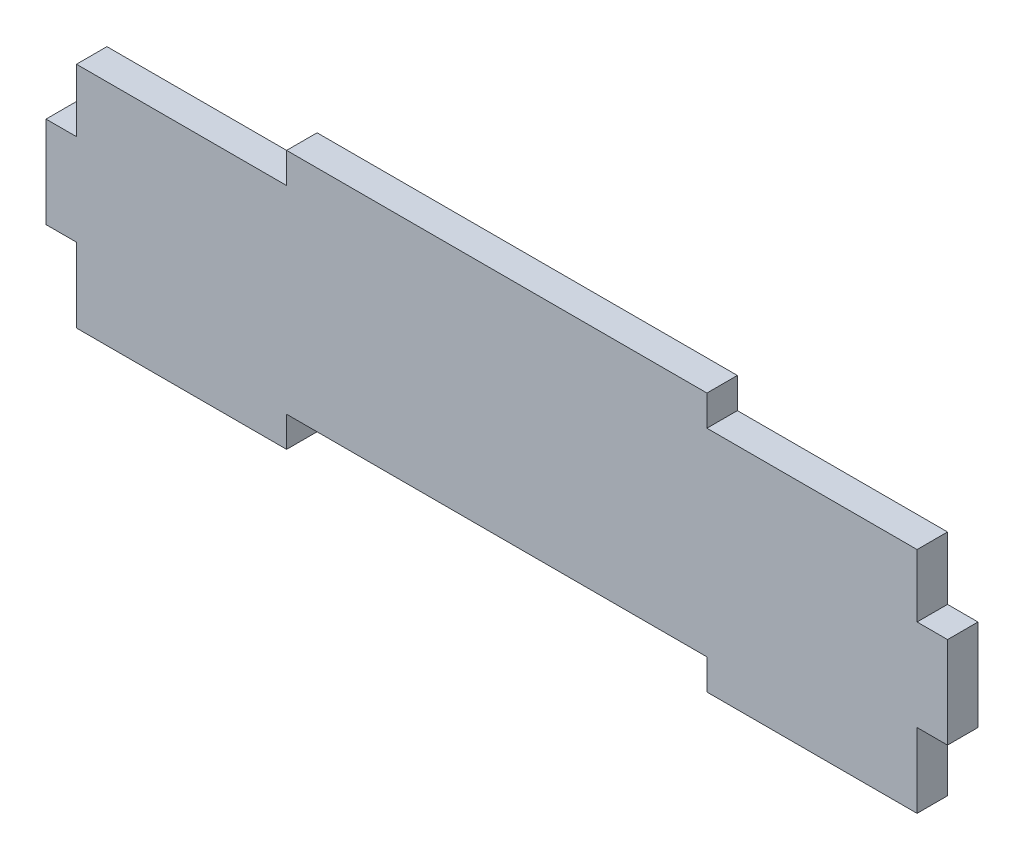
ISO-10303-21;
HEADER;
FILE_DESCRIPTION(('STEP AP214'),'2;1');
FILE_NAME('part.step','',(''),(''),'','','');
FILE_SCHEMA(('AUTOMOTIVE_DESIGN { 1 0 10303 214 1 1 1 1 }'));
ENDSEC;
DATA;
#1=APPLICATION_CONTEXT('core data for automotive mechanical design processes');
#2=APPLICATION_PROTOCOL_DEFINITION('international standard','automotive_design',2000,#1);
#3=PRODUCT_CONTEXT('',#1,'mechanical');
#4=PRODUCT('Part','Part','',(#3));
#5=PRODUCT_RELATED_PRODUCT_CATEGORY('part','',(#4));
#6=PRODUCT_DEFINITION_FORMATION('','',#4);
#7=PRODUCT_DEFINITION_CONTEXT('part definition',#1,'design');
#8=PRODUCT_DEFINITION('design','',#6,#7);
#9=PRODUCT_DEFINITION_SHAPE('','',#8);
#10=(LENGTH_UNIT() NAMED_UNIT(*) SI_UNIT(.MILLI.,.METRE.));
#11=(NAMED_UNIT(*) PLANE_ANGLE_UNIT() SI_UNIT($,.RADIAN.));
#12=(NAMED_UNIT(*) SI_UNIT($,.STERADIAN.) SOLID_ANGLE_UNIT());
#13=UNCERTAINTY_MEASURE_WITH_UNIT(LENGTH_MEASURE(1.E-05),#10,'distance_accuracy_value','');
#14=(GEOMETRIC_REPRESENTATION_CONTEXT(3) GLOBAL_UNCERTAINTY_ASSIGNED_CONTEXT((#13)) GLOBAL_UNIT_ASSIGNED_CONTEXT((#10,
#11,#12)) REPRESENTATION_CONTEXT('',''));
#15=CARTESIAN_POINT('',(0.,0.,0.));
#16=DIRECTION('',(0.,0.,1.));
#17=DIRECTION('',(1.,0.,0.));
#18=AXIS2_PLACEMENT_3D('',#15,#16,#17);
#19=CARTESIAN_POINT('',(-27.5909358016264,10.8810935461449,2.));
#20=DIRECTION('',(-1.,0.,0.));
#21=DIRECTION('',(0.,0.,1.));
#22=AXIS2_PLACEMENT_3D('',#19,#20,#21);
#23=PLANE('',#22);
#24=DIRECTION('',(0.,1.,0.));
#25=VECTOR('',#24,1.);
#26=CARTESIAN_POINT('',(-27.5909358016264,10.8810935461449,0.));
#27=LINE('',#26,#25);
#28=CARTESIAN_POINT('',(-27.5909358016264,10.8810935461449,0.));
#29=VERTEX_POINT('',#28);
#30=CARTESIAN_POINT('',(-27.5909358016264,15.,0.));
#31=VERTEX_POINT('',#30);
#32=EDGE_CURVE('E211',#29,#31,#27,.T.);
#33=ORIENTED_EDGE('',*,*,#32,.F.);
#34=DIRECTION('',(0.,0.,-1.));
#35=VECTOR('',#34,1.);
#36=CARTESIAN_POINT('',(-27.5909358016264,10.8810935461449,2.));
#37=LINE('',#36,#35);
#38=CARTESIAN_POINT('',(-27.5909358016264,10.8810935461449,2.));
#39=VERTEX_POINT('',#38);
#40=EDGE_CURVE('E11',#39,#29,#37,.T.);
#41=ORIENTED_EDGE('',*,*,#40,.F.);
#42=DIRECTION('',(0.,1.,0.));
#43=VECTOR('',#42,1.);
#44=CARTESIAN_POINT('',(-27.5909358016264,10.8810935461449,2.));
#45=LINE('',#44,#43);
#46=CARTESIAN_POINT('',(-27.5909358016264,15.,2.));
#47=VERTEX_POINT('',#46);
#48=EDGE_CURVE('E281',#39,#47,#45,.T.);
#49=ORIENTED_EDGE('',*,*,#48,.T.);
#50=DIRECTION('',(0.,0.,-1.));
#51=VECTOR('',#50,1.);
#52=CARTESIAN_POINT('',(-27.5909358016264,15.,2.));
#53=LINE('',#52,#51);
#54=EDGE_CURVE('E42',#47,#31,#53,.T.);
#55=ORIENTED_EDGE('',*,*,#54,.T.);
#56=EDGE_LOOP('',(#33,#41,#49,#55));
#57=FACE_BOUND('',#56,.T.);
#58=ADVANCED_FACE('F39',(#57),#23,.T.);
#59=CARTESIAN_POINT('',(-29.5909358016264,10.8810935461449,2.));
#60=DIRECTION('',(0.,1.,0.));
#61=DIRECTION('',(0.,0.,1.));
#62=AXIS2_PLACEMENT_3D('',#59,#60,#61);
#63=PLANE('',#62);
#64=DIRECTION('',(1.,0.,0.));
#65=VECTOR('',#64,1.);
#66=CARTESIAN_POINT('',(-29.5909358016264,10.8810935461449,0.));
#67=LINE('',#66,#65);
#68=CARTESIAN_POINT('',(-29.5909358016264,10.8810935461449,0.));
#69=VERTEX_POINT('',#68);
#70=EDGE_CURVE('E278',#69,#29,#67,.T.);
#71=ORIENTED_EDGE('',*,*,#70,.F.);
#72=DIRECTION('',(0.,0.,-1.));
#73=VECTOR('',#72,1.);
#74=CARTESIAN_POINT('',(-29.5909358016264,10.8810935461449,2.));
#75=LINE('',#74,#73);
#76=CARTESIAN_POINT('',(-29.5909358016264,10.8810935461449,2.));
#77=VERTEX_POINT('',#76);
#78=EDGE_CURVE('E49',#77,#69,#75,.T.);
#79=ORIENTED_EDGE('',*,*,#78,.F.);
#80=DIRECTION('',(1.,0.,0.));
#81=VECTOR('',#80,1.);
#82=CARTESIAN_POINT('',(-29.5909358016264,10.8810935461449,2.));
#83=LINE('',#82,#81);
#84=EDGE_CURVE('E204',#77,#39,#83,.T.);
#85=ORIENTED_EDGE('',*,*,#84,.T.);
#86=ORIENTED_EDGE('',*,*,#40,.T.);
#87=EDGE_LOOP('',(#71,#79,#85,#86));
#88=FACE_BOUND('',#87,.T.);
#89=ADVANCED_FACE('F341',(#88),#63,.T.);
#90=CARTESIAN_POINT('',(-29.5909358016264,4.88109354614489,2.));
#91=DIRECTION('',(-1.,0.,0.));
#92=DIRECTION('',(0.,0.,1.));
#93=AXIS2_PLACEMENT_3D('',#90,#91,#92);
#94=PLANE('',#93);
#95=DIRECTION('',(0.,1.,0.));
#96=VECTOR('',#95,1.);
#97=CARTESIAN_POINT('',(-29.5909358016264,4.88109354614489,0.));
#98=LINE('',#97,#96);
#99=CARTESIAN_POINT('',(-29.5909358016264,4.88109354614489,0.));
#100=VERTEX_POINT('',#99);
#101=EDGE_CURVE('E187',#100,#69,#98,.T.);
#102=ORIENTED_EDGE('',*,*,#101,.F.);
#103=DIRECTION('',(0.,0.,-1.));
#104=VECTOR('',#103,1.);
#105=CARTESIAN_POINT('',(-29.5909358016264,4.88109354614489,2.));
#106=LINE('',#105,#104);
#107=CARTESIAN_POINT('',(-29.5909358016264,4.88109354614489,2.));
#108=VERTEX_POINT('',#107);
#109=EDGE_CURVE('E181',#108,#100,#106,.T.);
#110=ORIENTED_EDGE('',*,*,#109,.F.);
#111=DIRECTION('',(0.,1.,0.));
#112=VECTOR('',#111,1.);
#113=CARTESIAN_POINT('',(-29.5909358016264,4.88109354614489,2.));
#114=LINE('',#113,#112);
#115=EDGE_CURVE('E185',#108,#77,#114,.T.);
#116=ORIENTED_EDGE('',*,*,#115,.T.);
#117=ORIENTED_EDGE('',*,*,#78,.T.);
#118=EDGE_LOOP('',(#102,#110,#116,#117));
#119=FACE_BOUND('',#118,.T.);
#120=ADVANCED_FACE('F183',(#119),#94,.T.);
#121=CARTESIAN_POINT('',(-29.5909358016264,4.88109354614489,2.));
#122=DIRECTION('',(0.,1.,0.));
#123=DIRECTION('',(-1.,0.,0.));
#124=AXIS2_PLACEMENT_3D('',#121,#122,#123);
#125=PLANE('',#124);
#126=DIRECTION('',(1.,0.,0.));
#127=VECTOR('',#126,1.);
#128=CARTESIAN_POINT('',(-29.5909358016264,4.88109354614489,0.));
#129=LINE('',#128,#127);
#130=CARTESIAN_POINT('',(-27.5909358016264,4.8810935461449,0.));
#131=VERTEX_POINT('',#130);
#132=EDGE_CURVE('E273',#100,#131,#129,.T.);
#133=ORIENTED_EDGE('',*,*,#132,.T.);
#134=DIRECTION('',(0.,0.,-1.));
#135=VECTOR('',#134,1.);
#136=CARTESIAN_POINT('',(-27.5909358016264,4.8810935461449,2.));
#137=LINE('',#136,#135);
#138=CARTESIAN_POINT('',(-27.5909358016264,4.8810935461449,2.));
#139=VERTEX_POINT('',#138);
#140=EDGE_CURVE('E192',#139,#131,#137,.T.);
#141=ORIENTED_EDGE('',*,*,#140,.F.);
#142=DIRECTION('',(1.,0.,0.));
#143=VECTOR('',#142,1.);
#144=CARTESIAN_POINT('',(-29.5909358016264,4.88109354614489,2.));
#145=LINE('',#144,#143);
#146=EDGE_CURVE('E195',#108,#139,#145,.T.);
#147=ORIENTED_EDGE('',*,*,#146,.F.);
#148=ORIENTED_EDGE('',*,*,#109,.T.);
#149=EDGE_LOOP('',(#133,#141,#147,#148));
#150=FACE_BOUND('',#149,.T.);
#151=ADVANCED_FACE('F196',(#150),#125,.F.);
#152=CARTESIAN_POINT('',(-27.5909358016264,0.,2.));
#153=DIRECTION('',(-1.,0.,0.));
#154=DIRECTION('',(0.,0.,1.));
#155=AXIS2_PLACEMENT_3D('',#152,#153,#154);
#156=PLANE('',#155);
#157=DIRECTION('',(0.,1.,0.));
#158=VECTOR('',#157,1.);
#159=CARTESIAN_POINT('',(-27.5909358016264,0.,0.));
#160=LINE('',#159,#158);
#161=CARTESIAN_POINT('',(-27.5909358016264,0.,0.));
#162=VERTEX_POINT('',#161);
#163=EDGE_CURVE('E269',#162,#131,#160,.T.);
#164=ORIENTED_EDGE('',*,*,#163,.F.);
#165=DIRECTION('',(0.,0.,-1.));
#166=VECTOR('',#165,1.);
#167=CARTESIAN_POINT('',(-27.5909358016264,0.,2.));
#168=LINE('',#167,#166);
#169=CARTESIAN_POINT('',(-27.5909358016264,0.,2.));
#170=VERTEX_POINT('',#169);
#171=EDGE_CURVE('E287',#170,#162,#168,.T.);
#172=ORIENTED_EDGE('',*,*,#171,.F.);
#173=DIRECTION('',(0.,1.,0.));
#174=VECTOR('',#173,1.);
#175=CARTESIAN_POINT('',(-27.5909358016264,0.,2.));
#176=LINE('',#175,#174);
#177=EDGE_CURVE('E201',#170,#139,#176,.T.);
#178=ORIENTED_EDGE('',*,*,#177,.T.);
#179=ORIENTED_EDGE('',*,*,#140,.T.);
#180=EDGE_LOOP('',(#164,#172,#178,#179));
#181=FACE_BOUND('',#180,.T.);
#182=ADVANCED_FACE('F354',(#181),#156,.T.);
#183=CARTESIAN_POINT('',(-13.7954679008132,0.,2.));
#184=DIRECTION('',(0.,-1.,0.));
#185=DIRECTION('',(0.,0.,-1.));
#186=AXIS2_PLACEMENT_3D('',#183,#184,#185);
#187=PLANE('',#186);
#188=DIRECTION('',(-1.,0.,0.));
#189=VECTOR('',#188,1.);
#190=CARTESIAN_POINT('',(-13.7954679008132,0.,0.));
#191=LINE('',#190,#189);
#192=CARTESIAN_POINT('',(-13.7954679008132,0.,0.));
#193=VERTEX_POINT('',#192);
#194=EDGE_CURVE('E265',#193,#162,#191,.T.);
#195=ORIENTED_EDGE('',*,*,#194,.F.);
#196=DIRECTION('',(0.,0.,-1.));
#197=VECTOR('',#196,1.);
#198=CARTESIAN_POINT('',(-13.7954679008132,0.,2.));
#199=LINE('',#198,#197);
#200=CARTESIAN_POINT('',(-13.7954679008132,0.,2.));
#201=VERTEX_POINT('',#200);
#202=EDGE_CURVE('E290',#201,#193,#199,.T.);
#203=ORIENTED_EDGE('',*,*,#202,.F.);
#204=DIRECTION('',(-1.,0.,0.));
#205=VECTOR('',#204,1.);
#206=CARTESIAN_POINT('',(-13.7954679008132,0.,2.));
#207=LINE('',#206,#205);
#208=EDGE_CURVE('E596',#201,#170,#207,.T.);
#209=ORIENTED_EDGE('',*,*,#208,.T.);
#210=ORIENTED_EDGE('',*,*,#171,.T.);
#211=EDGE_LOOP('',(#195,#203,#209,#210));
#212=FACE_BOUND('',#211,.T.);
#213=ADVANCED_FACE('F357',(#212),#187,.T.);
#214=CARTESIAN_POINT('',(-13.7954679008132,0.,2.));
#215=DIRECTION('',(-1.,0.,0.));
#216=DIRECTION('',(0.,0.,1.));
#217=AXIS2_PLACEMENT_3D('',#214,#215,#216);
#218=PLANE('',#217);
#219=DIRECTION('',(0.,1.,0.));
#220=VECTOR('',#219,1.);
#221=CARTESIAN_POINT('',(-13.7954679008132,0.,0.));
#222=LINE('',#221,#220);
#223=CARTESIAN_POINT('',(-13.7954679008132,2.,0.));
#224=VERTEX_POINT('',#223);
#225=EDGE_CURVE('E261',#193,#224,#222,.T.);
#226=ORIENTED_EDGE('',*,*,#225,.T.);
#227=DIRECTION('',(0.,0.,-1.));
#228=VECTOR('',#227,1.);
#229=CARTESIAN_POINT('',(-13.7954679008132,2.,2.));
#230=LINE('',#229,#228);
#231=CARTESIAN_POINT('',(-13.7954679008132,2.,2.));
#232=VERTEX_POINT('',#231);
#233=EDGE_CURVE('E293',#232,#224,#230,.T.);
#234=ORIENTED_EDGE('',*,*,#233,.F.);
#235=DIRECTION('',(0.,1.,0.));
#236=VECTOR('',#235,1.);
#237=CARTESIAN_POINT('',(-13.7954679008132,0.,2.));
#238=LINE('',#237,#236);
#239=EDGE_CURVE('E599',#201,#232,#238,.T.);
#240=ORIENTED_EDGE('',*,*,#239,.F.);
#241=ORIENTED_EDGE('',*,*,#202,.T.);
#242=EDGE_LOOP('',(#226,#234,#240,#241));
#243=FACE_BOUND('',#242,.T.);
#244=ADVANCED_FACE('F361',(#243),#218,.F.);
#245=CARTESIAN_POINT('',(13.7954679008132,2.,2.));
#246=DIRECTION('',(0.,-1.,0.));
#247=DIRECTION('',(0.,0.,-1.));
#248=AXIS2_PLACEMENT_3D('',#245,#246,#247);
#249=PLANE('',#248);
#250=DIRECTION('',(-1.,0.,0.));
#251=VECTOR('',#250,1.);
#252=CARTESIAN_POINT('',(13.7954679008132,2.,0.));
#253=LINE('',#252,#251);
#254=CARTESIAN_POINT('',(13.7954679008132,2.,0.));
#255=VERTEX_POINT('',#254);
#256=EDGE_CURVE('E257',#255,#224,#253,.T.);
#257=ORIENTED_EDGE('',*,*,#256,.F.);
#258=DIRECTION('',(0.,0.,-1.));
#259=VECTOR('',#258,1.);
#260=CARTESIAN_POINT('',(13.7954679008132,2.,2.));
#261=LINE('',#260,#259);
#262=CARTESIAN_POINT('',(13.7954679008132,2.,2.));
#263=VERTEX_POINT('',#262);
#264=EDGE_CURVE('E296',#263,#255,#261,.T.);
#265=ORIENTED_EDGE('',*,*,#264,.F.);
#266=DIRECTION('',(-1.,0.,0.));
#267=VECTOR('',#266,1.);
#268=CARTESIAN_POINT('',(13.7954679008132,2.,2.));
#269=LINE('',#268,#267);
#270=EDGE_CURVE('E604',#263,#232,#269,.T.);
#271=ORIENTED_EDGE('',*,*,#270,.T.);
#272=ORIENTED_EDGE('',*,*,#233,.T.);
#273=EDGE_LOOP('',(#257,#265,#271,#272));
#274=FACE_BOUND('',#273,.T.);
#275=ADVANCED_FACE('F365',(#274),#249,.T.);
#276=CARTESIAN_POINT('',(13.7954679008132,0.,2.));
#277=DIRECTION('',(-1.,0.,0.));
#278=DIRECTION('',(0.,0.,1.));
#279=AXIS2_PLACEMENT_3D('',#276,#277,#278);
#280=PLANE('',#279);
#281=DIRECTION('',(0.,1.,0.));
#282=VECTOR('',#281,1.);
#283=CARTESIAN_POINT('',(13.7954679008132,0.,0.));
#284=LINE('',#283,#282);
#285=CARTESIAN_POINT('',(13.7954679008132,0.,0.));
#286=VERTEX_POINT('',#285);
#287=EDGE_CURVE('E253',#286,#255,#284,.T.);
#288=ORIENTED_EDGE('',*,*,#287,.F.);
#289=DIRECTION('',(0.,0.,-1.));
#290=VECTOR('',#289,1.);
#291=CARTESIAN_POINT('',(13.7954679008132,0.,2.));
#292=LINE('',#291,#290);
#293=CARTESIAN_POINT('',(13.7954679008132,0.,2.));
#294=VERTEX_POINT('',#293);
#295=EDGE_CURVE('E299',#294,#286,#292,.T.);
#296=ORIENTED_EDGE('',*,*,#295,.F.);
#297=DIRECTION('',(0.,1.,0.));
#298=VECTOR('',#297,1.);
#299=CARTESIAN_POINT('',(13.7954679008132,0.,2.));
#300=LINE('',#299,#298);
#301=EDGE_CURVE('E586',#294,#263,#300,.T.);
#302=ORIENTED_EDGE('',*,*,#301,.T.);
#303=ORIENTED_EDGE('',*,*,#264,.T.);
#304=EDGE_LOOP('',(#288,#296,#302,#303));
#305=FACE_BOUND('',#304,.T.);
#306=ADVANCED_FACE('F369',(#305),#280,.T.);
#307=CARTESIAN_POINT('',(13.7954679008132,0.,2.));
#308=DIRECTION('',(0.,1.,0.));
#309=DIRECTION('',(0.,0.,1.));
#310=AXIS2_PLACEMENT_3D('',#307,#308,#309);
#311=PLANE('',#310);
#312=DIRECTION('',(1.,0.,0.));
#313=VECTOR('',#312,1.);
#314=CARTESIAN_POINT('',(13.7954679008132,0.,0.));
#315=LINE('',#314,#313);
#316=CARTESIAN_POINT('',(27.5909358016264,0.,0.));
#317=VERTEX_POINT('',#316);
#318=EDGE_CURVE('E250',#286,#317,#315,.T.);
#319=ORIENTED_EDGE('',*,*,#318,.T.);
#320=DIRECTION('',(0.,0.,-1.));
#321=VECTOR('',#320,1.);
#322=CARTESIAN_POINT('',(27.5909358016264,0.,2.));
#323=LINE('',#322,#321);
#324=CARTESIAN_POINT('',(27.5909358016264,0.,2.));
#325=VERTEX_POINT('',#324);
#326=EDGE_CURVE('E302',#325,#317,#323,.T.);
#327=ORIENTED_EDGE('',*,*,#326,.F.);
#328=DIRECTION('',(1.,0.,0.));
#329=VECTOR('',#328,1.);
#330=CARTESIAN_POINT('',(13.7954679008132,0.,2.));
#331=LINE('',#330,#329);
#332=EDGE_CURVE('E609',#294,#325,#331,.T.);
#333=ORIENTED_EDGE('',*,*,#332,.F.);
#334=ORIENTED_EDGE('',*,*,#295,.T.);
#335=EDGE_LOOP('',(#319,#327,#333,#334));
#336=FACE_BOUND('',#335,.T.);
#337=ADVANCED_FACE('F373',(#336),#311,.F.);
#338=CARTESIAN_POINT('',(27.5909358016264,0.,2.));
#339=DIRECTION('',(-1.,0.,0.));
#340=DIRECTION('',(0.,0.,1.));
#341=AXIS2_PLACEMENT_3D('',#338,#339,#340);
#342=PLANE('',#341);
#343=DIRECTION('',(0.,1.,0.));
#344=VECTOR('',#343,1.);
#345=CARTESIAN_POINT('',(27.5909358016264,0.,0.));
#346=LINE('',#345,#344);
#347=CARTESIAN_POINT('',(27.5909358016264,4.88109354614491,0.));
#348=VERTEX_POINT('',#347);
#349=EDGE_CURVE('E246',#317,#348,#346,.T.);
#350=ORIENTED_EDGE('',*,*,#349,.T.);
#351=DIRECTION('',(0.,0.,-1.));
#352=VECTOR('',#351,1.);
#353=CARTESIAN_POINT('',(27.5909358016264,4.88109354614491,2.));
#354=LINE('',#353,#352);
#355=CARTESIAN_POINT('',(27.5909358016264,4.88109354614491,2.));
#356=VERTEX_POINT('',#355);
#357=EDGE_CURVE('E306',#356,#348,#354,.T.);
#358=ORIENTED_EDGE('',*,*,#357,.F.);
#359=DIRECTION('',(0.,1.,0.));
#360=VECTOR('',#359,1.);
#361=CARTESIAN_POINT('',(27.5909358016264,0.,2.));
#362=LINE('',#361,#360);
#363=EDGE_CURVE('E612',#325,#356,#362,.T.);
#364=ORIENTED_EDGE('',*,*,#363,.F.);
#365=ORIENTED_EDGE('',*,*,#326,.T.);
#366=EDGE_LOOP('',(#350,#358,#364,#365));
#367=FACE_BOUND('',#366,.T.);
#368=ADVANCED_FACE('F377',(#367),#342,.F.);
#369=CARTESIAN_POINT('',(29.5909358016264,4.8810935461449,2.));
#370=DIRECTION('',(0.,-1.,0.));
#371=DIRECTION('',(1.,0.,0.));
#372=AXIS2_PLACEMENT_3D('',#369,#370,#371);
#373=PLANE('',#372);
#374=DIRECTION('',(-1.,0.,0.));
#375=VECTOR('',#374,1.);
#376=CARTESIAN_POINT('',(29.5909358016264,4.8810935461449,0.));
#377=LINE('',#376,#375);
#378=CARTESIAN_POINT('',(29.5909358016264,4.8810935461449,0.));
#379=VERTEX_POINT('',#378);
#380=EDGE_CURVE('E242',#379,#348,#377,.T.);
#381=ORIENTED_EDGE('',*,*,#380,.F.);
#382=DIRECTION('',(0.,0.,-1.));
#383=VECTOR('',#382,1.);
#384=CARTESIAN_POINT('',(29.5909358016264,4.8810935461449,2.));
#385=LINE('',#384,#383);
#386=CARTESIAN_POINT('',(29.5909358016264,4.8810935461449,2.));
#387=VERTEX_POINT('',#386);
#388=EDGE_CURVE('E309',#387,#379,#385,.T.);
#389=ORIENTED_EDGE('',*,*,#388,.F.);
#390=DIRECTION('',(-1.,0.,0.));
#391=VECTOR('',#390,1.);
#392=CARTESIAN_POINT('',(29.5909358016264,4.8810935461449,2.));
#393=LINE('',#392,#391);
#394=EDGE_CURVE('E577',#387,#356,#393,.T.);
#395=ORIENTED_EDGE('',*,*,#394,.T.);
#396=ORIENTED_EDGE('',*,*,#357,.T.);
#397=EDGE_LOOP('',(#381,#389,#395,#396));
#398=FACE_BOUND('',#397,.T.);
#399=ADVANCED_FACE('F381',(#398),#373,.T.);
#400=CARTESIAN_POINT('',(29.5909358016264,4.8810935461449,2.));
#401=DIRECTION('',(-1.,0.,0.));
#402=DIRECTION('',(0.,0.,1.));
#403=AXIS2_PLACEMENT_3D('',#400,#401,#402);
#404=PLANE('',#403);
#405=DIRECTION('',(0.,1.,0.));
#406=VECTOR('',#405,1.);
#407=CARTESIAN_POINT('',(29.5909358016264,4.8810935461449,0.));
#408=LINE('',#407,#406);
#409=CARTESIAN_POINT('',(29.5909358016264,10.8810935461449,0.));
#410=VERTEX_POINT('',#409);
#411=EDGE_CURVE('E239',#379,#410,#408,.T.);
#412=ORIENTED_EDGE('',*,*,#411,.T.);
#413=DIRECTION('',(0.,0.,-1.));
#414=VECTOR('',#413,1.);
#415=CARTESIAN_POINT('',(29.5909358016264,10.8810935461449,2.));
#416=LINE('',#415,#414);
#417=CARTESIAN_POINT('',(29.5909358016264,10.8810935461449,2.));
#418=VERTEX_POINT('',#417);
#419=EDGE_CURVE('E312',#418,#410,#416,.T.);
#420=ORIENTED_EDGE('',*,*,#419,.F.);
#421=DIRECTION('',(0.,1.,0.));
#422=VECTOR('',#421,1.);
#423=CARTESIAN_POINT('',(29.5909358016264,4.8810935461449,2.));
#424=LINE('',#423,#422);
#425=EDGE_CURVE('E571',#387,#418,#424,.T.);
#426=ORIENTED_EDGE('',*,*,#425,.F.);
#427=ORIENTED_EDGE('',*,*,#388,.T.);
#428=EDGE_LOOP('',(#412,#420,#426,#427));
#429=FACE_BOUND('',#428,.T.);
#430=ADVANCED_FACE('F385',(#429),#404,.F.);
#431=CARTESIAN_POINT('',(29.5909358016264,10.8810935461449,2.));
#432=DIRECTION('',(0.,-1.,0.));
#433=DIRECTION('',(0.,0.,-1.));
#434=AXIS2_PLACEMENT_3D('',#431,#432,#433);
#435=PLANE('',#434);
#436=DIRECTION('',(-1.,0.,0.));
#437=VECTOR('',#436,1.);
#438=CARTESIAN_POINT('',(29.5909358016264,10.8810935461449,0.));
#439=LINE('',#438,#437);
#440=CARTESIAN_POINT('',(27.5909358016264,10.8810935461449,0.));
#441=VERTEX_POINT('',#440);
#442=EDGE_CURVE('E236',#410,#441,#439,.T.);
#443=ORIENTED_EDGE('',*,*,#442,.T.);
#444=DIRECTION('',(0.,0.,-1.));
#445=VECTOR('',#444,1.);
#446=CARTESIAN_POINT('',(27.5909358016264,10.8810935461449,2.));
#447=LINE('',#446,#445);
#448=CARTESIAN_POINT('',(27.5909358016264,10.8810935461449,2.));
#449=VERTEX_POINT('',#448);
#450=EDGE_CURVE('E316',#449,#441,#447,.T.);
#451=ORIENTED_EDGE('',*,*,#450,.F.);
#452=DIRECTION('',(-1.,0.,0.));
#453=VECTOR('',#452,1.);
#454=CARTESIAN_POINT('',(29.5909358016264,10.8810935461449,2.));
#455=LINE('',#454,#453);
#456=EDGE_CURVE('E568',#418,#449,#455,.T.);
#457=ORIENTED_EDGE('',*,*,#456,.F.);
#458=ORIENTED_EDGE('',*,*,#419,.T.);
#459=EDGE_LOOP('',(#443,#451,#457,#458));
#460=FACE_BOUND('',#459,.T.);
#461=ADVANCED_FACE('F389',(#460),#435,.F.);
#462=CARTESIAN_POINT('',(27.5909358016264,10.8810935461449,2.));
#463=DIRECTION('',(-1.,0.,0.));
#464=DIRECTION('',(0.,0.,1.));
#465=AXIS2_PLACEMENT_3D('',#462,#463,#464);
#466=PLANE('',#465);
#467=DIRECTION('',(0.,1.,0.));
#468=VECTOR('',#467,1.);
#469=CARTESIAN_POINT('',(27.5909358016264,10.8810935461449,0.));
#470=LINE('',#469,#468);
#471=CARTESIAN_POINT('',(27.5909358016264,15.,0.));
#472=VERTEX_POINT('',#471);
#473=EDGE_CURVE('E233',#441,#472,#470,.T.);
#474=ORIENTED_EDGE('',*,*,#473,.T.);
#475=DIRECTION('',(0.,0.,-1.));
#476=VECTOR('',#475,1.);
#477=CARTESIAN_POINT('',(27.5909358016264,15.,2.));
#478=LINE('',#477,#476);
#479=CARTESIAN_POINT('',(27.5909358016264,15.,2.));
#480=VERTEX_POINT('',#479);
#481=EDGE_CURVE('E320',#480,#472,#478,.T.);
#482=ORIENTED_EDGE('',*,*,#481,.F.);
#483=DIRECTION('',(0.,1.,0.));
#484=VECTOR('',#483,1.);
#485=CARTESIAN_POINT('',(27.5909358016264,10.8810935461449,2.));
#486=LINE('',#485,#484);
#487=EDGE_CURVE('E566',#449,#480,#486,.T.);
#488=ORIENTED_EDGE('',*,*,#487,.F.);
#489=ORIENTED_EDGE('',*,*,#450,.T.);
#490=EDGE_LOOP('',(#474,#482,#488,#489));
#491=FACE_BOUND('',#490,.T.);
#492=ADVANCED_FACE('F393',(#491),#466,.F.);
#493=CARTESIAN_POINT('',(27.5909358016264,15.,2.));
#494=DIRECTION('',(0.,-1.,0.));
#495=DIRECTION('',(1.,0.,0.));
#496=AXIS2_PLACEMENT_3D('',#493,#494,#495);
#497=PLANE('',#496);
#498=DIRECTION('',(-1.,0.,0.));
#499=VECTOR('',#498,1.);
#500=CARTESIAN_POINT('',(27.5909358016264,15.,0.));
#501=LINE('',#500,#499);
#502=CARTESIAN_POINT('',(13.7954679008132,15.,0.));
#503=VERTEX_POINT('',#502);
#504=EDGE_CURVE('E230',#472,#503,#501,.T.);
#505=ORIENTED_EDGE('',*,*,#504,.T.);
#506=DIRECTION('',(0.,0.,-1.));
#507=VECTOR('',#506,1.);
#508=CARTESIAN_POINT('',(13.7954679008132,15.,2.));
#509=LINE('',#508,#507);
#510=CARTESIAN_POINT('',(13.7954679008132,15.,2.));
#511=VERTEX_POINT('',#510);
#512=EDGE_CURVE('E324',#511,#503,#509,.T.);
#513=ORIENTED_EDGE('',*,*,#512,.F.);
#514=DIRECTION('',(-1.,0.,0.));
#515=VECTOR('',#514,1.);
#516=CARTESIAN_POINT('',(27.5909358016264,15.,2.));
#517=LINE('',#516,#515);
#518=EDGE_CURVE('E559',#480,#511,#517,.T.);
#519=ORIENTED_EDGE('',*,*,#518,.F.);
#520=ORIENTED_EDGE('',*,*,#481,.T.);
#521=EDGE_LOOP('',(#505,#513,#519,#520));
#522=FACE_BOUND('',#521,.T.);
#523=ADVANCED_FACE('F397',(#522),#497,.F.);
#524=CARTESIAN_POINT('',(13.7954679008132,15.,2.));
#525=DIRECTION('',(-1.,0.,0.));
#526=DIRECTION('',(0.,0.,1.));
#527=AXIS2_PLACEMENT_3D('',#524,#525,#526);
#528=PLANE('',#527);
#529=DIRECTION('',(0.,1.,0.));
#530=VECTOR('',#529,1.);
#531=CARTESIAN_POINT('',(13.7954679008132,15.,0.));
#532=LINE('',#531,#530);
#533=CARTESIAN_POINT('',(13.7954679008132,17.,0.));
#534=VERTEX_POINT('',#533);
#535=EDGE_CURVE('E227',#503,#534,#532,.T.);
#536=ORIENTED_EDGE('',*,*,#535,.T.);
#537=DIRECTION('',(0.,0.,-1.));
#538=VECTOR('',#537,1.);
#539=CARTESIAN_POINT('',(13.7954679008132,17.,2.));
#540=LINE('',#539,#538);
#541=CARTESIAN_POINT('',(13.7954679008132,17.,2.));
#542=VERTEX_POINT('',#541);
#543=EDGE_CURVE('E328',#542,#534,#540,.T.);
#544=ORIENTED_EDGE('',*,*,#543,.F.);
#545=DIRECTION('',(0.,1.,0.));
#546=VECTOR('',#545,1.);
#547=CARTESIAN_POINT('',(13.7954679008132,15.,2.));
#548=LINE('',#547,#546);
#549=EDGE_CURVE('E556',#511,#542,#548,.T.);
#550=ORIENTED_EDGE('',*,*,#549,.F.);
#551=ORIENTED_EDGE('',*,*,#512,.T.);
#552=EDGE_LOOP('',(#536,#544,#550,#551));
#553=FACE_BOUND('',#552,.T.);
#554=ADVANCED_FACE('F401',(#553),#528,.F.);
#555=CARTESIAN_POINT('',(13.7954679008132,17.,2.));
#556=DIRECTION('',(0.,-1.,0.));
#557=DIRECTION('',(0.,0.,-1.));
#558=AXIS2_PLACEMENT_3D('',#555,#556,#557);
#559=PLANE('',#558);
#560=DIRECTION('',(-1.,0.,0.));
#561=VECTOR('',#560,1.);
#562=CARTESIAN_POINT('',(13.7954679008132,17.,0.));
#563=LINE('',#562,#561);
#564=CARTESIAN_POINT('',(-13.7954679008132,17.,0.));
#565=VERTEX_POINT('',#564);
#566=EDGE_CURVE('E223',#534,#565,#563,.T.);
#567=ORIENTED_EDGE('',*,*,#566,.T.);
#568=DIRECTION('',(0.,0.,-1.));
#569=VECTOR('',#568,1.);
#570=CARTESIAN_POINT('',(-13.7954679008132,17.,2.));
#571=LINE('',#570,#569);
#572=CARTESIAN_POINT('',(-13.7954679008132,17.,2.));
#573=VERTEX_POINT('',#572);
#574=EDGE_CURVE('E332',#573,#565,#571,.T.);
#575=ORIENTED_EDGE('',*,*,#574,.F.);
#576=DIRECTION('',(-1.,0.,0.));
#577=VECTOR('',#576,1.);
#578=CARTESIAN_POINT('',(13.7954679008132,17.,2.));
#579=LINE('',#578,#577);
#580=EDGE_CURVE('E554',#542,#573,#579,.T.);
#581=ORIENTED_EDGE('',*,*,#580,.F.);
#582=ORIENTED_EDGE('',*,*,#543,.T.);
#583=EDGE_LOOP('',(#567,#575,#581,#582));
#584=FACE_BOUND('',#583,.T.);
#585=ADVANCED_FACE('F405',(#584),#559,.F.);
#586=CARTESIAN_POINT('',(-13.7954679008132,15.,2.));
#587=DIRECTION('',(-1.,0.,0.));
#588=DIRECTION('',(0.,0.,1.));
#589=AXIS2_PLACEMENT_3D('',#586,#587,#588);
#590=PLANE('',#589);
#591=DIRECTION('',(0.,1.,0.));
#592=VECTOR('',#591,1.);
#593=CARTESIAN_POINT('',(-13.7954679008132,15.,0.));
#594=LINE('',#593,#592);
#595=CARTESIAN_POINT('',(-13.7954679008132,15.,0.));
#596=VERTEX_POINT('',#595);
#597=EDGE_CURVE('E219',#596,#565,#594,.T.);
#598=ORIENTED_EDGE('',*,*,#597,.F.);
#599=DIRECTION('',(0.,0.,-1.));
#600=VECTOR('',#599,1.);
#601=CARTESIAN_POINT('',(-13.7954679008132,15.,2.));
#602=LINE('',#601,#600);
#603=CARTESIAN_POINT('',(-13.7954679008132,15.,2.));
#604=VERTEX_POINT('',#603);
#605=EDGE_CURVE('E334',#604,#596,#602,.T.);
#606=ORIENTED_EDGE('',*,*,#605,.F.);
#607=DIRECTION('',(0.,1.,0.));
#608=VECTOR('',#607,1.);
#609=CARTESIAN_POINT('',(-13.7954679008132,15.,2.));
#610=LINE('',#609,#608);
#611=EDGE_CURVE('E629',#604,#573,#610,.T.);
#612=ORIENTED_EDGE('',*,*,#611,.T.);
#613=ORIENTED_EDGE('',*,*,#574,.T.);
#614=EDGE_LOOP('',(#598,#606,#612,#613));
#615=FACE_BOUND('',#614,.T.);
#616=ADVANCED_FACE('F409',(#615),#590,.T.);
#617=CARTESIAN_POINT('',(-27.5909358016264,15.,2.));
#618=DIRECTION('',(0.,1.,0.));
#619=DIRECTION('',(-1.,0.,0.));
#620=AXIS2_PLACEMENT_3D('',#617,#618,#619);
#621=PLANE('',#620);
#622=DIRECTION('',(1.,0.,0.));
#623=VECTOR('',#622,1.);
#624=CARTESIAN_POINT('',(-27.5909358016264,15.,0.));
#625=LINE('',#624,#623);
#626=EDGE_CURVE('E215',#31,#596,#625,.T.);
#627=ORIENTED_EDGE('',*,*,#626,.F.);
#628=ORIENTED_EDGE('',*,*,#54,.F.);
#629=DIRECTION('',(1.,0.,0.));
#630=VECTOR('',#629,1.);
#631=CARTESIAN_POINT('',(-27.5909358016264,15.,2.));
#632=LINE('',#631,#630);
#633=EDGE_CURVE('E632',#47,#604,#632,.T.);
#634=ORIENTED_EDGE('',*,*,#633,.T.);
#635=ORIENTED_EDGE('',*,*,#605,.T.);
#636=EDGE_LOOP('',(#627,#628,#634,#635));
#637=FACE_BOUND('',#636,.T.);
#638=ADVANCED_FACE('F338',(#637),#621,.T.);
#639=CARTESIAN_POINT('',(0.,0.,2.));
#640=DIRECTION('',(0.,0.,-1.));
#641=DIRECTION('',(-1.,0.,0.));
#642=AXIS2_PLACEMENT_3D('',#639,#640,#641);
#643=PLANE('',#642);
#644=ORIENTED_EDGE('',*,*,#48,.F.);
#645=ORIENTED_EDGE('',*,*,#84,.F.);
#646=ORIENTED_EDGE('',*,*,#115,.F.);
#647=ORIENTED_EDGE('',*,*,#146,.T.);
#648=ORIENTED_EDGE('',*,*,#177,.F.);
#649=ORIENTED_EDGE('',*,*,#208,.F.);
#650=ORIENTED_EDGE('',*,*,#239,.T.);
#651=ORIENTED_EDGE('',*,*,#270,.F.);
#652=ORIENTED_EDGE('',*,*,#301,.F.);
#653=ORIENTED_EDGE('',*,*,#332,.T.);
#654=ORIENTED_EDGE('',*,*,#363,.T.);
#655=ORIENTED_EDGE('',*,*,#394,.F.);
#656=ORIENTED_EDGE('',*,*,#425,.T.);
#657=ORIENTED_EDGE('',*,*,#456,.T.);
#658=ORIENTED_EDGE('',*,*,#487,.T.);
#659=ORIENTED_EDGE('',*,*,#518,.T.);
#660=ORIENTED_EDGE('',*,*,#549,.T.);
#661=ORIENTED_EDGE('',*,*,#580,.T.);
#662=ORIENTED_EDGE('',*,*,#611,.F.);
#663=ORIENTED_EDGE('',*,*,#633,.F.);
#664=EDGE_LOOP('',(#644,#645,#646,#647,#648,#649,#650,#651,#652,#653,#654,#655,#656,#657,#658,
#659,#660,#661,#662,#663));
#665=FACE_BOUND('',#664,.T.);
#666=ADVANCED_FACE('F203',(#665),#643,.F.);
#667=CARTESIAN_POINT('',(0.,0.,0.));
#668=DIRECTION('',(0.,0.,-1.));
#669=DIRECTION('',(-1.,0.,0.));
#670=AXIS2_PLACEMENT_3D('',#667,#668,#669);
#671=PLANE('',#670);
#672=ORIENTED_EDGE('',*,*,#32,.T.);
#673=ORIENTED_EDGE('',*,*,#626,.T.);
#674=ORIENTED_EDGE('',*,*,#597,.T.);
#675=ORIENTED_EDGE('',*,*,#566,.F.);
#676=ORIENTED_EDGE('',*,*,#535,.F.);
#677=ORIENTED_EDGE('',*,*,#504,.F.);
#678=ORIENTED_EDGE('',*,*,#473,.F.);
#679=ORIENTED_EDGE('',*,*,#442,.F.);
#680=ORIENTED_EDGE('',*,*,#411,.F.);
#681=ORIENTED_EDGE('',*,*,#380,.T.);
#682=ORIENTED_EDGE('',*,*,#349,.F.);
#683=ORIENTED_EDGE('',*,*,#318,.F.);
#684=ORIENTED_EDGE('',*,*,#287,.T.);
#685=ORIENTED_EDGE('',*,*,#256,.T.);
#686=ORIENTED_EDGE('',*,*,#225,.F.);
#687=ORIENTED_EDGE('',*,*,#194,.T.);
#688=ORIENTED_EDGE('',*,*,#163,.T.);
#689=ORIENTED_EDGE('',*,*,#132,.F.);
#690=ORIENTED_EDGE('',*,*,#101,.T.);
#691=ORIENTED_EDGE('',*,*,#70,.T.);
#692=EDGE_LOOP('',(#672,#673,#674,#675,#676,#677,#678,#679,#680,#681,#682,#683,#684,#685,#686,
#687,#688,#689,#690,#691));
#693=FACE_BOUND('',#692,.T.);
#694=ADVANCED_FACE('F340',(#693),#671,.T.);
#695=CLOSED_SHELL('',(#58,#89,#120,#151,#182,#213,#244,#275,#306,#337,#368,#399,#430,#461,#492,
#523,#554,#585,#616,#638,#666,#694));
#696=MANIFOLD_SOLID_BREP('B2',#695);
#697=ADVANCED_BREP_SHAPE_REPRESENTATION('',(#18,#696),#14);
#698=SHAPE_DEFINITION_REPRESENTATION(#9,#697);
ENDSEC;
END-ISO-10303-21;
